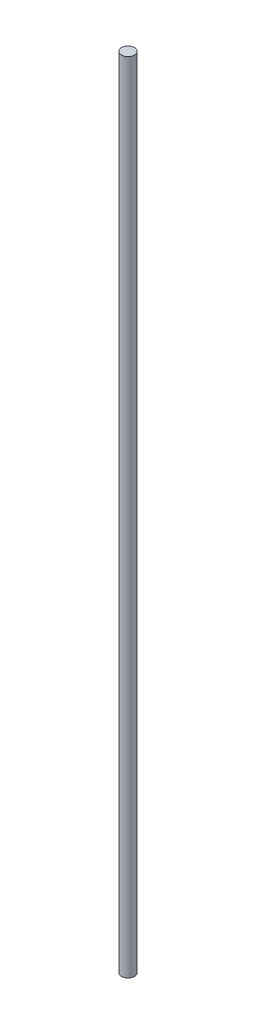
ISO-10303-21;
HEADER;
FILE_DESCRIPTION(('STEP AP214'),'2;1');
FILE_NAME('part.step','',(''),(''),'','','');
FILE_SCHEMA(('AUTOMOTIVE_DESIGN { 1 0 10303 214 1 1 1 1 }'));
ENDSEC;
DATA;
#1=APPLICATION_CONTEXT('core data for automotive mechanical design processes');
#2=APPLICATION_PROTOCOL_DEFINITION('international standard','automotive_design',2000,#1);
#3=PRODUCT_CONTEXT('',#1,'mechanical');
#4=PRODUCT('Part','Part','',(#3));
#5=PRODUCT_RELATED_PRODUCT_CATEGORY('part','',(#4));
#6=PRODUCT_DEFINITION_FORMATION('','',#4);
#7=PRODUCT_DEFINITION_CONTEXT('part definition',#1,'design');
#8=PRODUCT_DEFINITION('design','',#6,#7);
#9=PRODUCT_DEFINITION_SHAPE('','',#8);
#10=(LENGTH_UNIT() NAMED_UNIT(*) SI_UNIT(.MILLI.,.METRE.));
#11=(NAMED_UNIT(*) PLANE_ANGLE_UNIT() SI_UNIT($,.RADIAN.));
#12=(NAMED_UNIT(*) SI_UNIT($,.STERADIAN.) SOLID_ANGLE_UNIT());
#13=UNCERTAINTY_MEASURE_WITH_UNIT(LENGTH_MEASURE(1.E-05),#10,'distance_accuracy_value','');
#14=(GEOMETRIC_REPRESENTATION_CONTEXT(3) GLOBAL_UNCERTAINTY_ASSIGNED_CONTEXT((#13)) GLOBAL_UNIT_ASSIGNED_CONTEXT((#10,
#11,#12)) REPRESENTATION_CONTEXT('',''));
#15=CARTESIAN_POINT('',(0.,0.,0.));
#16=DIRECTION('',(0.,0.,1.));
#17=DIRECTION('',(1.,0.,0.));
#18=AXIS2_PLACEMENT_3D('',#15,#16,#17);
#19=CARTESIAN_POINT('',(0.,489.05,0.));
#20=DIRECTION('',(0.,-1.,0.));
#21=DIRECTION('',(0.,0.,-1.));
#22=AXIS2_PLACEMENT_3D('',#19,#20,#21);
#23=CYLINDRICAL_SURFACE('',#22,4.);
#24=CARTESIAN_POINT('',(0.,489.05,0.));
#25=DIRECTION('',(0.,1.,0.));
#26=DIRECTION('',(0.,0.,1.));
#27=AXIS2_PLACEMENT_3D('',#24,#25,#26);
#28=CIRCLE('',#27,4.);
#29=CARTESIAN_POINT('',(0.,489.05,4.));
#30=VERTEX_POINT('',#29);
#31=EDGE_CURVE('E10',#30,#30,#28,.T.);
#32=ORIENTED_EDGE('',*,*,#31,.F.);
#33=EDGE_LOOP('',(#32));
#34=FACE_BOUND('',#33,.T.);
#35=CARTESIAN_POINT('',(0.,0.,0.));
#36=DIRECTION('',(0.,1.,0.));
#37=DIRECTION('',(0.,0.,1.));
#38=AXIS2_PLACEMENT_3D('',#35,#36,#37);
#39=CIRCLE('',#38,4.);
#40=CARTESIAN_POINT('',(0.,0.,4.));
#41=VERTEX_POINT('',#40);
#42=EDGE_CURVE('E36',#41,#41,#39,.T.);
#43=ORIENTED_EDGE('',*,*,#42,.T.);
#44=EDGE_LOOP('',(#43));
#45=FACE_BOUND('',#44,.T.);
#46=ADVANCED_FACE('F33',(#34,#45),#23,.T.);
#47=CARTESIAN_POINT('',(0.,489.05,0.));
#48=DIRECTION('',(0.,1.,0.));
#49=DIRECTION('',(0.,0.,1.));
#50=AXIS2_PLACEMENT_3D('',#47,#48,#49);
#51=PLANE('',#50);
#52=ORIENTED_EDGE('',*,*,#31,.T.);
#53=EDGE_LOOP('',(#52));
#54=FACE_BOUND('',#53,.T.);
#55=ADVANCED_FACE('F48',(#54),#51,.T.);
#56=CARTESIAN_POINT('',(0.,0.,0.));
#57=DIRECTION('',(0.,1.,0.));
#58=DIRECTION('',(0.,0.,1.));
#59=AXIS2_PLACEMENT_3D('',#56,#57,#58);
#60=PLANE('',#59);
#61=ORIENTED_EDGE('',*,*,#42,.F.);
#62=EDGE_LOOP('',(#61));
#63=FACE_BOUND('',#62,.T.);
#64=ADVANCED_FACE('F46',(#63),#60,.F.);
#65=CLOSED_SHELL('',(#46,#55,#64));
#66=MANIFOLD_SOLID_BREP('B2',#65);
#67=ADVANCED_BREP_SHAPE_REPRESENTATION('',(#18,#66),#14);
#68=SHAPE_DEFINITION_REPRESENTATION(#9,#67);
ENDSEC;
END-ISO-10303-21;
